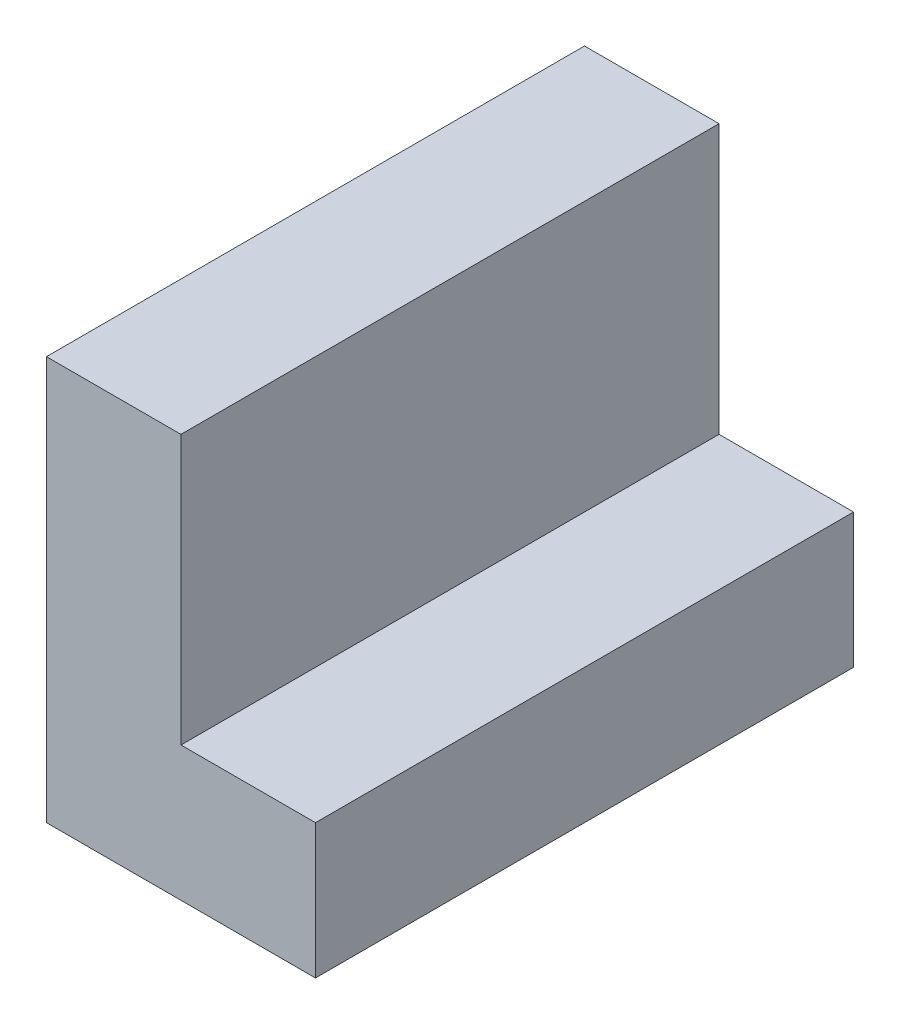
ISO-10303-21;
HEADER;
FILE_DESCRIPTION(('STEP AP214'),'2;1');
FILE_NAME('part.step','',(''),(''),'','','');
FILE_SCHEMA(('AUTOMOTIVE_DESIGN { 1 0 10303 214 1 1 1 1 }'));
ENDSEC;
DATA;
#1=APPLICATION_CONTEXT('core data for automotive mechanical design processes');
#2=APPLICATION_PROTOCOL_DEFINITION('international standard','automotive_design',2000,#1);
#3=PRODUCT_CONTEXT('',#1,'mechanical');
#4=PRODUCT('Part','Part','',(#3));
#5=PRODUCT_RELATED_PRODUCT_CATEGORY('part','',(#4));
#6=PRODUCT_DEFINITION_FORMATION('','',#4);
#7=PRODUCT_DEFINITION_CONTEXT('part definition',#1,'design');
#8=PRODUCT_DEFINITION('design','',#6,#7);
#9=PRODUCT_DEFINITION_SHAPE('','',#8);
#10=(LENGTH_UNIT() NAMED_UNIT(*) SI_UNIT(.MILLI.,.METRE.));
#11=(NAMED_UNIT(*) PLANE_ANGLE_UNIT() SI_UNIT($,.RADIAN.));
#12=(NAMED_UNIT(*) SI_UNIT($,.STERADIAN.) SOLID_ANGLE_UNIT());
#13=UNCERTAINTY_MEASURE_WITH_UNIT(LENGTH_MEASURE(1.E-05),#10,'distance_accuracy_value','');
#14=(GEOMETRIC_REPRESENTATION_CONTEXT(3) GLOBAL_UNCERTAINTY_ASSIGNED_CONTEXT((#13)) GLOBAL_UNIT_ASSIGNED_CONTEXT((#10,
#11,#12)) REPRESENTATION_CONTEXT('',''));
#15=CARTESIAN_POINT('',(0.,0.,0.));
#16=DIRECTION('',(0.,0.,1.));
#17=DIRECTION('',(1.,0.,0.));
#18=AXIS2_PLACEMENT_3D('',#15,#16,#17);
#19=CARTESIAN_POINT('',(0.,30.,40.));
#20=DIRECTION('',(1.,0.,0.));
#21=DIRECTION('',(0.,1.,0.));
#22=AXIS2_PLACEMENT_3D('',#19,#20,#21);
#23=PLANE('',#22);
#24=DIRECTION('',(0.,-1.,0.));
#25=VECTOR('',#24,1.);
#26=CARTESIAN_POINT('',(0.,30.,0.));
#27=LINE('',#26,#25);
#28=CARTESIAN_POINT('',(0.,30.,0.));
#29=VERTEX_POINT('',#28);
#30=CARTESIAN_POINT('',(0.,0.,0.));
#31=VERTEX_POINT('',#30);
#32=EDGE_CURVE('E123',#29,#31,#27,.T.);
#33=ORIENTED_EDGE('',*,*,#32,.T.);
#34=DIRECTION('',(0.,0.,-1.));
#35=VECTOR('',#34,1.);
#36=CARTESIAN_POINT('',(0.,0.,40.));
#37=LINE('',#36,#35);
#38=CARTESIAN_POINT('',(0.,0.,40.));
#39=VERTEX_POINT('',#38);
#40=EDGE_CURVE('E11',#39,#31,#37,.T.);
#41=ORIENTED_EDGE('',*,*,#40,.F.);
#42=DIRECTION('',(0.,-1.,0.));
#43=VECTOR('',#42,1.);
#44=CARTESIAN_POINT('',(0.,30.,40.));
#45=LINE('',#44,#43);
#46=CARTESIAN_POINT('',(0.,30.,40.));
#47=VERTEX_POINT('',#46);
#48=EDGE_CURVE('E133',#47,#39,#45,.T.);
#49=ORIENTED_EDGE('',*,*,#48,.F.);
#50=DIRECTION('',(0.,0.,-1.));
#51=VECTOR('',#50,1.);
#52=CARTESIAN_POINT('',(0.,30.,40.));
#53=LINE('',#52,#51);
#54=EDGE_CURVE('E119',#47,#29,#53,.T.);
#55=ORIENTED_EDGE('',*,*,#54,.T.);
#56=EDGE_LOOP('',(#33,#41,#49,#55));
#57=FACE_BOUND('',#56,.T.);
#58=ADVANCED_FACE('F39',(#57),#23,.F.);
#59=CARTESIAN_POINT('',(0.,0.,40.));
#60=DIRECTION('',(0.,1.,0.));
#61=DIRECTION('',(0.,0.,1.));
#62=AXIS2_PLACEMENT_3D('',#59,#60,#61);
#63=PLANE('',#62);
#64=DIRECTION('',(1.,0.,0.));
#65=VECTOR('',#64,1.);
#66=CARTESIAN_POINT('',(0.,0.,0.));
#67=LINE('',#66,#65);
#68=CARTESIAN_POINT('',(20.,0.,0.));
#69=VERTEX_POINT('',#68);
#70=EDGE_CURVE('E126',#31,#69,#67,.T.);
#71=ORIENTED_EDGE('',*,*,#70,.T.);
#72=DIRECTION('',(0.,0.,-1.));
#73=VECTOR('',#72,1.);
#74=CARTESIAN_POINT('',(20.,0.,40.));
#75=LINE('',#74,#73);
#76=CARTESIAN_POINT('',(20.,0.,40.));
#77=VERTEX_POINT('',#76);
#78=EDGE_CURVE('E47',#77,#69,#75,.T.);
#79=ORIENTED_EDGE('',*,*,#78,.F.);
#80=DIRECTION('',(1.,0.,0.));
#81=VECTOR('',#80,1.);
#82=CARTESIAN_POINT('',(0.,0.,40.));
#83=LINE('',#82,#81);
#84=EDGE_CURVE('E92',#39,#77,#83,.T.);
#85=ORIENTED_EDGE('',*,*,#84,.F.);
#86=ORIENTED_EDGE('',*,*,#40,.T.);
#87=EDGE_LOOP('',(#71,#79,#85,#86));
#88=FACE_BOUND('',#87,.T.);
#89=ADVANCED_FACE('F157',(#88),#63,.F.);
#90=CARTESIAN_POINT('',(20.,0.,40.));
#91=DIRECTION('',(-1.,0.,0.));
#92=DIRECTION('',(0.,0.,1.));
#93=AXIS2_PLACEMENT_3D('',#90,#91,#92);
#94=PLANE('',#93);
#95=DIRECTION('',(0.,1.,0.));
#96=VECTOR('',#95,1.);
#97=CARTESIAN_POINT('',(20.,0.,0.));
#98=LINE('',#97,#96);
#99=CARTESIAN_POINT('',(20.,10.,0.));
#100=VERTEX_POINT('',#99);
#101=EDGE_CURVE('E128',#69,#100,#98,.T.);
#102=ORIENTED_EDGE('',*,*,#101,.T.);
#103=DIRECTION('',(0.,0.,-1.));
#104=VECTOR('',#103,1.);
#105=CARTESIAN_POINT('',(20.,10.,40.));
#106=LINE('',#105,#104);
#107=CARTESIAN_POINT('',(20.,10.,40.));
#108=VERTEX_POINT('',#107);
#109=EDGE_CURVE('E114',#108,#100,#106,.T.);
#110=ORIENTED_EDGE('',*,*,#109,.F.);
#111=DIRECTION('',(0.,1.,0.));
#112=VECTOR('',#111,1.);
#113=CARTESIAN_POINT('',(20.,0.,40.));
#114=LINE('',#113,#112);
#115=EDGE_CURVE('E105',#77,#108,#114,.T.);
#116=ORIENTED_EDGE('',*,*,#115,.F.);
#117=ORIENTED_EDGE('',*,*,#78,.T.);
#118=EDGE_LOOP('',(#102,#110,#116,#117));
#119=FACE_BOUND('',#118,.T.);
#120=ADVANCED_FACE('F139',(#119),#94,.F.);
#121=CARTESIAN_POINT('',(20.,10.,40.));
#122=DIRECTION('',(0.,-1.,0.));
#123=DIRECTION('',(1.,0.,0.));
#124=AXIS2_PLACEMENT_3D('',#121,#122,#123);
#125=PLANE('',#124);
#126=DIRECTION('',(-1.,0.,0.));
#127=VECTOR('',#126,1.);
#128=CARTESIAN_POINT('',(20.,10.,0.));
#129=LINE('',#128,#127);
#130=CARTESIAN_POINT('',(10.,10.,0.));
#131=VERTEX_POINT('',#130);
#132=EDGE_CURVE('E113',#100,#131,#129,.T.);
#133=ORIENTED_EDGE('',*,*,#132,.T.);
#134=DIRECTION('',(0.,0.,-1.));
#135=VECTOR('',#134,1.);
#136=CARTESIAN_POINT('',(10.,10.,40.));
#137=LINE('',#136,#135);
#138=CARTESIAN_POINT('',(10.,10.,40.));
#139=VERTEX_POINT('',#138);
#140=EDGE_CURVE('E110',#139,#131,#137,.T.);
#141=ORIENTED_EDGE('',*,*,#140,.F.);
#142=DIRECTION('',(-1.,0.,0.));
#143=VECTOR('',#142,1.);
#144=CARTESIAN_POINT('',(20.,10.,40.));
#145=LINE('',#144,#143);
#146=EDGE_CURVE('E99',#108,#139,#145,.T.);
#147=ORIENTED_EDGE('',*,*,#146,.F.);
#148=ORIENTED_EDGE('',*,*,#109,.T.);
#149=EDGE_LOOP('',(#133,#141,#147,#148));
#150=FACE_BOUND('',#149,.T.);
#151=ADVANCED_FACE('F111',(#150),#125,.F.);
#152=CARTESIAN_POINT('',(10.,10.,40.));
#153=DIRECTION('',(-1.,0.,0.));
#154=DIRECTION('',(0.,0.,1.));
#155=AXIS2_PLACEMENT_3D('',#152,#153,#154);
#156=PLANE('',#155);
#157=DIRECTION('',(0.,1.,0.));
#158=VECTOR('',#157,1.);
#159=CARTESIAN_POINT('',(10.,10.,0.));
#160=LINE('',#159,#158);
#161=CARTESIAN_POINT('',(10.,30.,0.));
#162=VERTEX_POINT('',#161);
#163=EDGE_CURVE('E78',#131,#162,#160,.T.);
#164=ORIENTED_EDGE('',*,*,#163,.T.);
#165=DIRECTION('',(0.,0.,-1.));
#166=VECTOR('',#165,1.);
#167=CARTESIAN_POINT('',(10.,30.,40.));
#168=LINE('',#167,#166);
#169=CARTESIAN_POINT('',(10.,30.,40.));
#170=VERTEX_POINT('',#169);
#171=EDGE_CURVE('E115',#170,#162,#168,.T.);
#172=ORIENTED_EDGE('',*,*,#171,.F.);
#173=DIRECTION('',(0.,1.,0.));
#174=VECTOR('',#173,1.);
#175=CARTESIAN_POINT('',(10.,10.,40.));
#176=LINE('',#175,#174);
#177=EDGE_CURVE('E103',#139,#170,#176,.T.);
#178=ORIENTED_EDGE('',*,*,#177,.F.);
#179=ORIENTED_EDGE('',*,*,#140,.T.);
#180=EDGE_LOOP('',(#164,#172,#178,#179));
#181=FACE_BOUND('',#180,.T.);
#182=ADVANCED_FACE('F117',(#181),#156,.F.);
#183=CARTESIAN_POINT('',(10.,30.,40.));
#184=DIRECTION('',(0.,-1.,0.));
#185=DIRECTION('',(0.,0.,-1.));
#186=AXIS2_PLACEMENT_3D('',#183,#184,#185);
#187=PLANE('',#186);
#188=DIRECTION('',(-1.,0.,0.));
#189=VECTOR('',#188,1.);
#190=CARTESIAN_POINT('',(10.,30.,0.));
#191=LINE('',#190,#189);
#192=EDGE_CURVE('E84',#162,#29,#191,.T.);
#193=ORIENTED_EDGE('',*,*,#192,.T.);
#194=ORIENTED_EDGE('',*,*,#54,.F.);
#195=DIRECTION('',(-1.,0.,0.));
#196=VECTOR('',#195,1.);
#197=CARTESIAN_POINT('',(10.,30.,40.));
#198=LINE('',#197,#196);
#199=EDGE_CURVE('E55',#170,#47,#198,.T.);
#200=ORIENTED_EDGE('',*,*,#199,.F.);
#201=ORIENTED_EDGE('',*,*,#171,.T.);
#202=EDGE_LOOP('',(#193,#194,#200,#201));
#203=FACE_BOUND('',#202,.T.);
#204=ADVANCED_FACE('F146',(#203),#187,.F.);
#205=CARTESIAN_POINT('',(0.,0.,40.));
#206=DIRECTION('',(0.,0.,1.));
#207=DIRECTION('',(1.,0.,0.));
#208=AXIS2_PLACEMENT_3D('',#205,#206,#207);
#209=PLANE('',#208);
#210=ORIENTED_EDGE('',*,*,#48,.T.);
#211=ORIENTED_EDGE('',*,*,#84,.T.);
#212=ORIENTED_EDGE('',*,*,#115,.T.);
#213=ORIENTED_EDGE('',*,*,#146,.T.);
#214=ORIENTED_EDGE('',*,*,#177,.T.);
#215=ORIENTED_EDGE('',*,*,#199,.T.);
#216=EDGE_LOOP('',(#210,#211,#212,#213,#214,#215));
#217=FACE_BOUND('',#216,.T.);
#218=ADVANCED_FACE('F101',(#217),#209,.T.);
#219=CARTESIAN_POINT('',(0.,0.,0.));
#220=DIRECTION('',(0.,0.,1.));
#221=DIRECTION('',(1.,0.,0.));
#222=AXIS2_PLACEMENT_3D('',#219,#220,#221);
#223=PLANE('',#222);
#224=ORIENTED_EDGE('',*,*,#32,.F.);
#225=ORIENTED_EDGE('',*,*,#192,.F.);
#226=ORIENTED_EDGE('',*,*,#163,.F.);
#227=ORIENTED_EDGE('',*,*,#132,.F.);
#228=ORIENTED_EDGE('',*,*,#101,.F.);
#229=ORIENTED_EDGE('',*,*,#70,.F.);
#230=EDGE_LOOP('',(#224,#225,#226,#227,#228,#229));
#231=FACE_BOUND('',#230,.T.);
#232=ADVANCED_FACE('F142',(#231),#223,.F.);
#233=CLOSED_SHELL('',(#58,#89,#120,#151,#182,#204,#218,#232));
#234=MANIFOLD_SOLID_BREP('B2',#233);
#235=ADVANCED_BREP_SHAPE_REPRESENTATION('',(#18,#234),#14);
#236=SHAPE_DEFINITION_REPRESENTATION(#9,#235);
ENDSEC;
END-ISO-10303-21;
